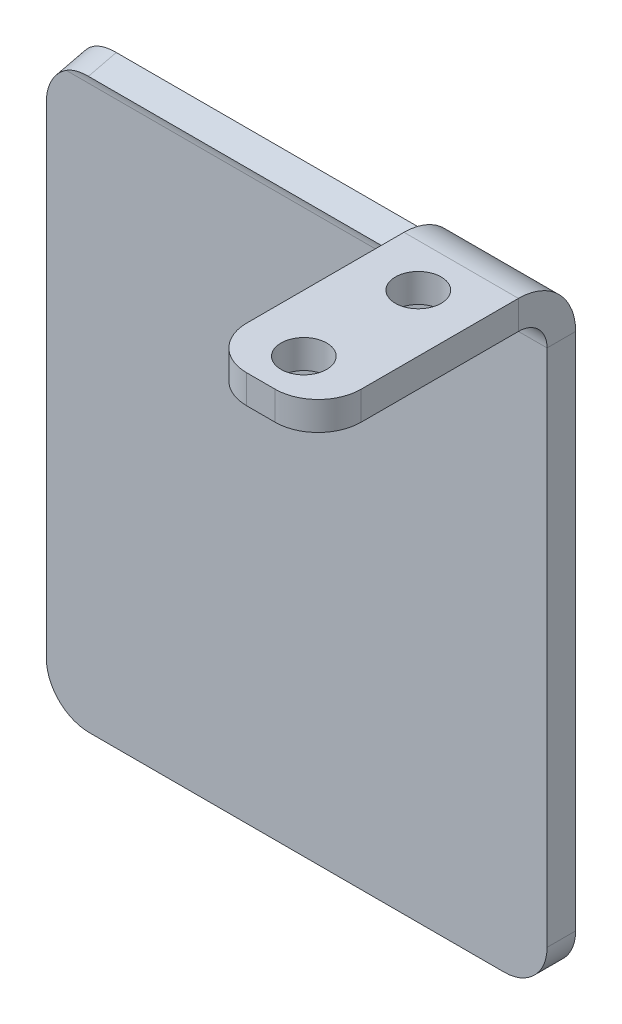
ISO-10303-21;
HEADER;
FILE_DESCRIPTION(('STEP AP214'),'2;1');
FILE_NAME('part.step','',(''),(''),'','','');
FILE_SCHEMA(('AUTOMOTIVE_DESIGN { 1 0 10303 214 1 1 1 1 }'));
ENDSEC;
DATA;
#1=APPLICATION_CONTEXT('core data for automotive mechanical design processes');
#2=APPLICATION_PROTOCOL_DEFINITION('international standard','automotive_design',2000,#1);
#3=PRODUCT_CONTEXT('',#1,'mechanical');
#4=PRODUCT('Part','Part','',(#3));
#5=PRODUCT_RELATED_PRODUCT_CATEGORY('part','',(#4));
#6=PRODUCT_DEFINITION_FORMATION('','',#4);
#7=PRODUCT_DEFINITION_CONTEXT('part definition',#1,'design');
#8=PRODUCT_DEFINITION('design','',#6,#7);
#9=PRODUCT_DEFINITION_SHAPE('','',#8);
#10=(LENGTH_UNIT() NAMED_UNIT(*) SI_UNIT(.MILLI.,.METRE.));
#11=(NAMED_UNIT(*) PLANE_ANGLE_UNIT() SI_UNIT($,.RADIAN.));
#12=(NAMED_UNIT(*) SI_UNIT($,.STERADIAN.) SOLID_ANGLE_UNIT());
#13=UNCERTAINTY_MEASURE_WITH_UNIT(LENGTH_MEASURE(1.E-05),#10,'distance_accuracy_value','');
#14=(GEOMETRIC_REPRESENTATION_CONTEXT(3) GLOBAL_UNCERTAINTY_ASSIGNED_CONTEXT((#13)) GLOBAL_UNIT_ASSIGNED_CONTEXT((#10,
#11,#12)) REPRESENTATION_CONTEXT('',''));
#15=CARTESIAN_POINT('',(0.,0.,0.));
#16=DIRECTION('',(0.,0.,1.));
#17=DIRECTION('',(1.,0.,0.));
#18=AXIS2_PLACEMENT_3D('',#15,#16,#17);
#19=CARTESIAN_POINT('',(-17.5,-3.28761101961529,22.));
#20=DIRECTION('',(-1.,0.,0.));
#21=DIRECTION('',(0.,1.,0.));
#22=AXIS2_PLACEMENT_3D('',#19,#20,#21);
#23=PLANE('',#22);
#24=DIRECTION('',(0.,1.,0.));
#25=VECTOR('',#24,1.);
#26=CARTESIAN_POINT('',(-17.5,-3.28761101961529,22.));
#27=LINE('',#26,#25);
#28=CARTESIAN_POINT('',(-17.5,-40.2876110196153,22.0000000000001));
#29=VERTEX_POINT('',#28);
#30=CARTESIAN_POINT('',(-17.5,-6.60255809537411,22.));
#31=VERTEX_POINT('',#30);
#32=EDGE_CURVE('E173',#29,#31,#27,.T.);
#33=ORIENTED_EDGE('',*,*,#32,.T.);
#34=DIRECTION('',(0.,0.235237573302994,-0.971937901363312));
#35=VECTOR('',#34,1.);
#36=CARTESIAN_POINT('',(-17.5,-6.41911981084092,21.2420827217545));
#37=LINE('',#36,#35);
#38=CARTESIAN_POINT('',(-17.5,-6.11849924146373,20.));
#39=VERTEX_POINT('',#38);
#40=EDGE_CURVE('E379',#31,#39,#37,.T.);
#41=ORIENTED_EDGE('',*,*,#40,.T.);
#42=DIRECTION('',(0.,1.,0.));
#43=VECTOR('',#42,1.);
#44=CARTESIAN_POINT('',(-17.5,-3.2876110196153,20.));
#45=LINE('',#44,#43);
#46=CARTESIAN_POINT('',(-17.5,-40.2876110196153,20.0000000000001));
#47=VERTEX_POINT('',#46);
#48=EDGE_CURVE('E209',#47,#39,#45,.T.);
#49=ORIENTED_EDGE('',*,*,#48,.F.);
#50=DIRECTION('',(0.,0.,-1.));
#51=VECTOR('',#50,1.);
#52=CARTESIAN_POINT('',(-17.5,-40.2876110196153,22.0000000000001));
#53=LINE('',#52,#51);
#54=EDGE_CURVE('E373',#47,#29,#53,.F.);
#55=ORIENTED_EDGE('',*,*,#54,.T.);
#56=EDGE_LOOP('',(#33,#41,#49,#55));
#57=FACE_BOUND('',#56,.T.);
#58=ADVANCED_FACE('F53',(#57),#23,.T.);
#59=CARTESIAN_POINT('',(17.5,-3.28761101961529,22.));
#60=DIRECTION('',(1.,0.,0.));
#61=DIRECTION('',(0.,-1.,0.));
#62=AXIS2_PLACEMENT_3D('',#59,#60,#61);
#63=PLANE('',#62);
#64=DIRECTION('',(0.,-1.,0.));
#65=VECTOR('',#64,1.);
#66=CARTESIAN_POINT('',(17.5,-3.28761101961529,22.));
#67=LINE('',#66,#65);
#68=CARTESIAN_POINT('',(17.5,-4.00000000000001,22.));
#69=VERTEX_POINT('',#68);
#70=CARTESIAN_POINT('',(17.5,-40.2876110196153,22.0000000000001));
#71=VERTEX_POINT('',#70);
#72=EDGE_CURVE('E187',#69,#71,#67,.T.);
#73=ORIENTED_EDGE('',*,*,#72,.T.);
#74=DIRECTION('',(0.,0.,-1.));
#75=VECTOR('',#74,1.);
#76=CARTESIAN_POINT('',(17.5,-40.2876110196153,22.0000000000001));
#77=LINE('',#76,#75);
#78=CARTESIAN_POINT('',(17.5,-40.2876110196153,20.0000000000001));
#79=VERTEX_POINT('',#78);
#80=EDGE_CURVE('E12',#71,#79,#77,.T.);
#81=ORIENTED_EDGE('',*,*,#80,.T.);
#82=DIRECTION('',(0.,-1.,0.));
#83=VECTOR('',#82,1.);
#84=CARTESIAN_POINT('',(17.5,-3.2876110196153,20.));
#85=LINE('',#84,#83);
#86=CARTESIAN_POINT('',(17.5,-4.00000000000002,20.));
#87=VERTEX_POINT('',#86);
#88=EDGE_CURVE('E195',#87,#79,#85,.T.);
#89=ORIENTED_EDGE('',*,*,#88,.F.);
#90=DIRECTION('',(0.,0.,1.));
#91=VECTOR('',#90,1.);
#92=CARTESIAN_POINT('',(17.5,-4.00000000000001,22.));
#93=LINE('',#92,#91);
#94=EDGE_CURVE('E172',#87,#69,#93,.T.);
#95=ORIENTED_EDGE('',*,*,#94,.T.);
#96=EDGE_LOOP('',(#73,#81,#89,#95));
#97=FACE_BOUND('',#96,.T.);
#98=ADVANCED_FACE('F198',(#97),#63,.T.);
#99=CARTESIAN_POINT('',(0.,-23.2876110196153,22.0000000000001));
#100=DIRECTION('',(0.,0.,1.));
#101=DIRECTION('',(0.,-1.,0.));
#102=AXIS2_PLACEMENT_3D('',#99,#100,#101);
#103=PLANE('',#102);
#104=DIRECTION('',(-1.,0.,0.));
#105=VECTOR('',#104,1.);
#106=CARTESIAN_POINT('',(0.,-4.00000000000001,22.));
#107=LINE('',#106,#105);
#108=CARTESIAN_POINT('',(-16.1129178578161,-4.00000000000001,22.));
#109=VERTEX_POINT('',#108);
#110=EDGE_CURVE('E162',#69,#109,#107,.T.);
#111=ORIENTED_EDGE('',*,*,#110,.T.);
#112=CARTESIAN_POINT('',(-14.5,-6.60255809537411,22.));
#113=DIRECTION('',(0.,0.,1.));
#114=DIRECTION('',(0.,1.,0.));
#115=AXIS2_PLACEMENT_3D('',#112,#113,#114);
#116=ELLIPSE('',#115,3.0866169492845,3.);
#117=EDGE_CURVE('E375',#109,#31,#116,.T.);
#118=ORIENTED_EDGE('',*,*,#117,.T.);
#119=ORIENTED_EDGE('',*,*,#32,.F.);
#120=CARTESIAN_POINT('',(-14.5,-40.2876110196153,22.0000000000001));
#121=DIRECTION('',(0.,0.,1.));
#122=DIRECTION('',(0.,-1.,0.));
#123=AXIS2_PLACEMENT_3D('',#120,#121,#122);
#124=CIRCLE('',#123,3.);
#125=CARTESIAN_POINT('',(-14.5,-43.2876110196153,22.0000000000001));
#126=VERTEX_POINT('',#125);
#127=EDGE_CURVE('E372',#29,#126,#124,.T.);
#128=ORIENTED_EDGE('',*,*,#127,.T.);
#129=DIRECTION('',(-1.,0.,0.));
#130=VECTOR('',#129,1.);
#131=CARTESIAN_POINT('',(-17.5,-43.2876110196153,22.0000000000001));
#132=LINE('',#131,#130);
#133=CARTESIAN_POINT('',(14.5,-43.2876110196153,22.0000000000001));
#134=VERTEX_POINT('',#133);
#135=EDGE_CURVE('E194',#134,#126,#132,.T.);
#136=ORIENTED_EDGE('',*,*,#135,.F.);
#137=CARTESIAN_POINT('',(14.5,-40.2876110196153,22.0000000000001));
#138=DIRECTION('',(0.,0.,1.));
#139=DIRECTION('',(0.,-1.,0.));
#140=AXIS2_PLACEMENT_3D('',#137,#138,#139);
#141=CIRCLE('',#140,3.);
#142=EDGE_CURVE('E191',#134,#71,#141,.T.);
#143=ORIENTED_EDGE('',*,*,#142,.T.);
#144=ORIENTED_EDGE('',*,*,#72,.F.);
#145=EDGE_LOOP('',(#111,#118,#119,#128,#136,#143,#144));
#146=FACE_BOUND('',#145,.T.);
#147=ADVANCED_FACE('F188',(#146),#103,.T.);
#148=CARTESIAN_POINT('',(-17.5,-43.2876110196153,22.0000000000001));
#149=DIRECTION('',(0.,-1.,0.));
#150=DIRECTION('',(-1.,0.,0.));
#151=AXIS2_PLACEMENT_3D('',#148,#149,#150);
#152=PLANE('',#151);
#153=ORIENTED_EDGE('',*,*,#135,.T.);
#154=DIRECTION('',(0.,0.,-1.));
#155=VECTOR('',#154,1.);
#156=CARTESIAN_POINT('',(-14.5,-43.2876110196153,22.0000000000001));
#157=LINE('',#156,#155);
#158=CARTESIAN_POINT('',(-14.5,-43.2876110196153,20.0000000000001));
#159=VERTEX_POINT('',#158);
#160=EDGE_CURVE('E61',#126,#159,#157,.T.);
#161=ORIENTED_EDGE('',*,*,#160,.T.);
#162=DIRECTION('',(-1.,0.,0.));
#163=VECTOR('',#162,1.);
#164=CARTESIAN_POINT('',(-17.5,-43.2876110196153,20.0000000000001));
#165=LINE('',#164,#163);
#166=CARTESIAN_POINT('',(14.5,-43.2876110196153,20.0000000000001));
#167=VERTEX_POINT('',#166);
#168=EDGE_CURVE('E212',#167,#159,#165,.T.);
#169=ORIENTED_EDGE('',*,*,#168,.F.);
#170=DIRECTION('',(0.,0.,-1.));
#171=VECTOR('',#170,1.);
#172=CARTESIAN_POINT('',(14.5,-43.2876110196153,22.0000000000001));
#173=LINE('',#172,#171);
#174=EDGE_CURVE('E270',#167,#134,#173,.F.);
#175=ORIENTED_EDGE('',*,*,#174,.T.);
#176=EDGE_LOOP('',(#153,#161,#169,#175));
#177=FACE_BOUND('',#176,.T.);
#178=ADVANCED_FACE('F310',(#177),#152,.T.);
#179=CARTESIAN_POINT('',(0.,-23.2876110196153,20.0000000000001));
#180=DIRECTION('',(0.,0.,1.));
#181=DIRECTION('',(0.,-1.,0.));
#182=AXIS2_PLACEMENT_3D('',#179,#180,#181);
#183=PLANE('',#182);
#184=ORIENTED_EDGE('',*,*,#48,.T.);
#185=CARTESIAN_POINT('',(-14.5,-6.11849924146373,20.));
#186=DIRECTION('',(0.,0.,1.));
#187=DIRECTION('',(0.,1.,0.));
#188=AXIS2_PLACEMENT_3D('',#185,#186,#187);
#189=ELLIPSE('',#188,3.0866169492845,3.);
#190=CARTESIAN_POINT('',(-16.681814452463,-4.00000000000001,20.));
#191=VERTEX_POINT('',#190);
#192=EDGE_CURVE('E271',#39,#191,#189,.F.);
#193=ORIENTED_EDGE('',*,*,#192,.T.);
#194=DIRECTION('',(-1.,0.,0.));
#195=VECTOR('',#194,1.);
#196=CARTESIAN_POINT('',(0.,-4.00000000000001,20.));
#197=LINE('',#196,#195);
#198=EDGE_CURVE('E200',#87,#191,#197,.T.);
#199=ORIENTED_EDGE('',*,*,#198,.F.);
#200=ORIENTED_EDGE('',*,*,#88,.T.);
#201=CARTESIAN_POINT('',(14.5,-40.2876110196153,20.0000000000001));
#202=DIRECTION('',(0.,0.,1.));
#203=DIRECTION('',(0.,-1.,0.));
#204=AXIS2_PLACEMENT_3D('',#201,#202,#203);
#205=CIRCLE('',#204,3.);
#206=EDGE_CURVE('E76',#79,#167,#205,.F.);
#207=ORIENTED_EDGE('',*,*,#206,.T.);
#208=ORIENTED_EDGE('',*,*,#168,.T.);
#209=CARTESIAN_POINT('',(-14.5,-40.2876110196153,20.0000000000001));
#210=DIRECTION('',(0.,0.,1.));
#211=DIRECTION('',(0.,-1.,0.));
#212=AXIS2_PLACEMENT_3D('',#209,#210,#211);
#213=CIRCLE('',#212,3.);
#214=EDGE_CURVE('E68',#159,#47,#213,.F.);
#215=ORIENTED_EDGE('',*,*,#214,.T.);
#216=EDGE_LOOP('',(#184,#193,#199,#200,#207,#208,#215));
#217=FACE_BOUND('',#216,.T.);
#218=ADVANCED_FACE('F294',(#217),#183,.F.);
#219=CARTESIAN_POINT('',(17.5,-2.,38.));
#220=DIRECTION('',(0.,0.,1.));
#221=DIRECTION('',(1.,0.,0.));
#222=AXIS2_PLACEMENT_3D('',#219,#220,#221);
#223=PLANE('',#222);
#224=DIRECTION('',(1.,0.,0.));
#225=VECTOR('',#224,1.);
#226=CARTESIAN_POINT('',(17.5,0.,38.));
#227=LINE('',#226,#225);
#228=CARTESIAN_POINT('',(12.5,0.,38.));
#229=VERTEX_POINT('',#228);
#230=CARTESIAN_POINT('',(14.5,0.,38.));
#231=VERTEX_POINT('',#230);
#232=EDGE_CURVE('E347',#229,#231,#227,.T.);
#233=ORIENTED_EDGE('',*,*,#232,.F.);
#234=DIRECTION('',(0.,1.,0.));
#235=VECTOR('',#234,1.);
#236=CARTESIAN_POINT('',(12.5,-2.,38.));
#237=LINE('',#236,#235);
#238=CARTESIAN_POINT('',(12.5,-2.,38.));
#239=VERTEX_POINT('',#238);
#240=EDGE_CURVE('E231',#229,#239,#237,.F.);
#241=ORIENTED_EDGE('',*,*,#240,.T.);
#242=DIRECTION('',(1.,0.,0.));
#243=VECTOR('',#242,1.);
#244=CARTESIAN_POINT('',(17.5,-2.,38.));
#245=LINE('',#244,#243);
#246=CARTESIAN_POINT('',(14.5,-2.,38.));
#247=VERTEX_POINT('',#246);
#248=EDGE_CURVE('E343',#239,#247,#245,.T.);
#249=ORIENTED_EDGE('',*,*,#248,.T.);
#250=DIRECTION('',(0.,1.,0.));
#251=VECTOR('',#250,1.);
#252=CARTESIAN_POINT('',(14.5,-2.,38.));
#253=LINE('',#252,#251);
#254=EDGE_CURVE('E228',#247,#231,#253,.T.);
#255=ORIENTED_EDGE('',*,*,#254,.T.);
#256=EDGE_LOOP('',(#233,#241,#249,#255));
#257=FACE_BOUND('',#256,.T.);
#258=ADVANCED_FACE('F290',(#257),#223,.T.);
#259=CARTESIAN_POINT('',(0.,-2.,0.));
#260=DIRECTION('',(0.,-1.,0.));
#261=DIRECTION('',(0.,0.,-1.));
#262=AXIS2_PLACEMENT_3D('',#259,#260,#261);
#263=PLANE('',#262);
#264=CARTESIAN_POINT('',(13.5,-2.,35.));
#265=DIRECTION('',(0.,-1.,0.));
#266=DIRECTION('',(0.,0.,-1.));
#267=AXIS2_PLACEMENT_3D('',#264,#265,#266);
#268=CIRCLE('',#267,1.6);
#269=CARTESIAN_POINT('',(13.5,-2.,33.4));
#270=VERTEX_POINT('',#269);
#271=EDGE_CURVE('E218',#270,#270,#268,.T.);
#272=ORIENTED_EDGE('',*,*,#271,.F.);
#273=EDGE_LOOP('',(#272));
#274=FACE_BOUND('',#273,.T.);
#275=CARTESIAN_POINT('',(13.5,-2.,27.));
#276=DIRECTION('',(0.,-1.,0.));
#277=DIRECTION('',(0.,0.,-1.));
#278=AXIS2_PLACEMENT_3D('',#275,#276,#277);
#279=CIRCLE('',#278,1.6);
#280=CARTESIAN_POINT('',(13.5,-2.,25.4));
#281=VERTEX_POINT('',#280);
#282=EDGE_CURVE('E408',#281,#281,#279,.T.);
#283=ORIENTED_EDGE('',*,*,#282,.F.);
#284=EDGE_LOOP('',(#283));
#285=FACE_BOUND('',#284,.T.);
#286=ORIENTED_EDGE('',*,*,#248,.F.);
#287=CARTESIAN_POINT('',(12.5,-2.,35.));
#288=DIRECTION('',(0.,-1.,0.));
#289=DIRECTION('',(0.,0.,-1.));
#290=AXIS2_PLACEMENT_3D('',#287,#288,#289);
#291=CIRCLE('',#290,3.);
#292=CARTESIAN_POINT('',(9.50000000000001,-2.,35.));
#293=VERTEX_POINT('',#292);
#294=EDGE_CURVE('E235',#239,#293,#291,.T.);
#295=ORIENTED_EDGE('',*,*,#294,.T.);
#296=DIRECTION('',(0.,0.,1.));
#297=VECTOR('',#296,1.);
#298=CARTESIAN_POINT('',(9.5,-2.,20.));
#299=LINE('',#298,#297);
#300=CARTESIAN_POINT('',(9.5,-2.,24.));
#301=VERTEX_POINT('',#300);
#302=EDGE_CURVE('E340',#301,#293,#299,.T.);
#303=ORIENTED_EDGE('',*,*,#302,.F.);
#304=DIRECTION('',(-1.,0.,0.));
#305=VECTOR('',#304,1.);
#306=CARTESIAN_POINT('',(0.,-2.,24.));
#307=LINE('',#306,#305);
#308=CARTESIAN_POINT('',(17.5,-2.,24.));
#309=VERTEX_POINT('',#308);
#310=EDGE_CURVE('E367',#309,#301,#307,.T.);
#311=ORIENTED_EDGE('',*,*,#310,.F.);
#312=DIRECTION('',(0.,0.,-1.));
#313=VECTOR('',#312,1.);
#314=CARTESIAN_POINT('',(17.5,-2.,20.));
#315=LINE('',#314,#313);
#316=CARTESIAN_POINT('',(17.5,-2.,35.));
#317=VERTEX_POINT('',#316);
#318=EDGE_CURVE('E362',#317,#309,#315,.T.);
#319=ORIENTED_EDGE('',*,*,#318,.F.);
#320=CARTESIAN_POINT('',(14.5,-2.,35.));
#321=DIRECTION('',(0.,-1.,0.));
#322=DIRECTION('',(0.,0.,-1.));
#323=AXIS2_PLACEMENT_3D('',#320,#321,#322);
#324=CIRCLE('',#323,3.);
#325=EDGE_CURVE('E233',#317,#247,#324,.T.);
#326=ORIENTED_EDGE('',*,*,#325,.T.);
#327=EDGE_LOOP('',(#286,#295,#303,#311,#319,#326));
#328=FACE_BOUND('',#327,.T.);
#329=ADVANCED_FACE('F293',(#274,#285,#328),#263,.T.);
#330=CARTESIAN_POINT('',(17.5,-2.,20.));
#331=DIRECTION('',(1.,0.,0.));
#332=DIRECTION('',(0.,0.,-1.));
#333=AXIS2_PLACEMENT_3D('',#330,#331,#332);
#334=PLANE('',#333);
#335=DIRECTION('',(0.,0.,-1.));
#336=VECTOR('',#335,1.);
#337=CARTESIAN_POINT('',(17.5,0.,20.));
#338=LINE('',#337,#336);
#339=CARTESIAN_POINT('',(17.5,0.,35.));
#340=VERTEX_POINT('',#339);
#341=CARTESIAN_POINT('',(17.5,0.,24.));
#342=VERTEX_POINT('',#341);
#343=EDGE_CURVE('E360',#340,#342,#338,.T.);
#344=ORIENTED_EDGE('',*,*,#343,.F.);
#345=DIRECTION('',(0.,1.,0.));
#346=VECTOR('',#345,1.);
#347=CARTESIAN_POINT('',(17.5,-2.,35.));
#348=LINE('',#347,#346);
#349=EDGE_CURVE('E237',#340,#317,#348,.F.);
#350=ORIENTED_EDGE('',*,*,#349,.T.);
#351=ORIENTED_EDGE('',*,*,#318,.T.);
#352=DIRECTION('',(0.,-1.,0.));
#353=VECTOR('',#352,1.);
#354=CARTESIAN_POINT('',(17.5,-2.,24.));
#355=LINE('',#354,#353);
#356=EDGE_CURVE('E182',#342,#309,#355,.T.);
#357=ORIENTED_EDGE('',*,*,#356,.F.);
#358=EDGE_LOOP('',(#344,#350,#351,#357));
#359=FACE_BOUND('',#358,.T.);
#360=ADVANCED_FACE('F298',(#359),#334,.T.);
#361=CARTESIAN_POINT('',(0.,0.,0.));
#362=DIRECTION('',(0.,-1.,0.));
#363=DIRECTION('',(0.,0.,-1.));
#364=AXIS2_PLACEMENT_3D('',#361,#362,#363);
#365=PLANE('',#364);
#366=CARTESIAN_POINT('',(13.5,0.,35.));
#367=DIRECTION('',(0.,-1.,0.));
#368=DIRECTION('',(0.,0.,-1.));
#369=AXIS2_PLACEMENT_3D('',#366,#367,#368);
#370=CIRCLE('',#369,1.6);
#371=CARTESIAN_POINT('',(13.5,0.,33.4));
#372=VERTEX_POINT('',#371);
#373=EDGE_CURVE('E217',#372,#372,#370,.T.);
#374=ORIENTED_EDGE('',*,*,#373,.T.);
#375=EDGE_LOOP('',(#374));
#376=FACE_BOUND('',#375,.T.);
#377=CARTESIAN_POINT('',(13.5,0.,27.));
#378=DIRECTION('',(0.,-1.,0.));
#379=DIRECTION('',(0.,0.,-1.));
#380=AXIS2_PLACEMENT_3D('',#377,#378,#379);
#381=CIRCLE('',#380,1.6);
#382=CARTESIAN_POINT('',(13.5,0.,25.4));
#383=VERTEX_POINT('',#382);
#384=EDGE_CURVE('E214',#383,#383,#381,.T.);
#385=ORIENTED_EDGE('',*,*,#384,.T.);
#386=EDGE_LOOP('',(#385));
#387=FACE_BOUND('',#386,.T.);
#388=DIRECTION('',(0.,0.,1.));
#389=VECTOR('',#388,1.);
#390=CARTESIAN_POINT('',(9.5,0.,20.));
#391=LINE('',#390,#389);
#392=CARTESIAN_POINT('',(9.5,0.,24.));
#393=VERTEX_POINT('',#392);
#394=CARTESIAN_POINT('',(9.50000000000001,0.,35.));
#395=VERTEX_POINT('',#394);
#396=EDGE_CURVE('E350',#393,#395,#391,.T.);
#397=ORIENTED_EDGE('',*,*,#396,.T.);
#398=CARTESIAN_POINT('',(12.5,0.,35.));
#399=DIRECTION('',(0.,-1.,0.));
#400=DIRECTION('',(0.,0.,-1.));
#401=AXIS2_PLACEMENT_3D('',#398,#399,#400);
#402=CIRCLE('',#401,3.);
#403=EDGE_CURVE('E226',#395,#229,#402,.F.);
#404=ORIENTED_EDGE('',*,*,#403,.T.);
#405=ORIENTED_EDGE('',*,*,#232,.T.);
#406=CARTESIAN_POINT('',(14.5,0.,35.));
#407=DIRECTION('',(0.,-1.,0.));
#408=DIRECTION('',(0.,0.,-1.));
#409=AXIS2_PLACEMENT_3D('',#406,#407,#408);
#410=CIRCLE('',#409,3.);
#411=EDGE_CURVE('E224',#231,#340,#410,.F.);
#412=ORIENTED_EDGE('',*,*,#411,.T.);
#413=ORIENTED_EDGE('',*,*,#343,.T.);
#414=DIRECTION('',(-1.,0.,0.));
#415=VECTOR('',#414,1.);
#416=CARTESIAN_POINT('',(0.,0.,24.));
#417=LINE('',#416,#415);
#418=EDGE_CURVE('E357',#342,#393,#417,.T.);
#419=ORIENTED_EDGE('',*,*,#418,.T.);
#420=EDGE_LOOP('',(#397,#404,#405,#412,#413,#419));
#421=FACE_BOUND('',#420,.T.);
#422=ADVANCED_FACE('F302',(#376,#387,#421),#365,.F.);
#423=CARTESIAN_POINT('',(9.5,-2.,20.));
#424=DIRECTION('',(-1.,0.,0.));
#425=DIRECTION('',(0.,0.,1.));
#426=AXIS2_PLACEMENT_3D('',#423,#424,#425);
#427=PLANE('',#426);
#428=ORIENTED_EDGE('',*,*,#302,.T.);
#429=DIRECTION('',(0.,1.,0.));
#430=VECTOR('',#429,1.);
#431=CARTESIAN_POINT('',(9.50000000000001,-2.,35.));
#432=LINE('',#431,#430);
#433=EDGE_CURVE('E203',#293,#395,#432,.T.);
#434=ORIENTED_EDGE('',*,*,#433,.T.);
#435=ORIENTED_EDGE('',*,*,#396,.F.);
#436=DIRECTION('',(0.,1.,0.));
#437=VECTOR('',#436,1.);
#438=CARTESIAN_POINT('',(9.5,-2.,24.));
#439=LINE('',#438,#437);
#440=EDGE_CURVE('E346',#301,#393,#439,.T.);
#441=ORIENTED_EDGE('',*,*,#440,.F.);
#442=EDGE_LOOP('',(#428,#434,#435,#441));
#443=FACE_BOUND('',#442,.T.);
#444=ADVANCED_FACE('F289',(#443),#427,.T.);
#445=CARTESIAN_POINT('',(17.5,-4.,24.));
#446=DIRECTION('',(-1.,0.,0.));
#447=DIRECTION('',(0.,0.,1.));
#448=AXIS2_PLACEMENT_3D('',#445,#446,#447);
#449=PLANE('',#448);
#450=ORIENTED_EDGE('',*,*,#94,.F.);
#451=CARTESIAN_POINT('',(17.5,-4.,24.));
#452=DIRECTION('',(1.,0.,0.));
#453=DIRECTION('',(0.,0.,-1.));
#454=AXIS2_PLACEMENT_3D('',#451,#452,#453);
#455=CIRCLE('',#454,4.);
#456=EDGE_CURVE('E221',#87,#342,#455,.T.);
#457=ORIENTED_EDGE('',*,*,#456,.T.);
#458=ORIENTED_EDGE('',*,*,#356,.T.);
#459=CARTESIAN_POINT('',(17.5,-4.,24.));
#460=DIRECTION('',(1.,0.,0.));
#461=DIRECTION('',(0.,0.,1.));
#462=AXIS2_PLACEMENT_3D('',#459,#460,#461);
#463=CIRCLE('',#462,2.);
#464=EDGE_CURVE('E167',#69,#309,#463,.T.);
#465=ORIENTED_EDGE('',*,*,#464,.F.);
#466=EDGE_LOOP('',(#450,#457,#458,#465));
#467=FACE_BOUND('',#466,.T.);
#468=ADVANCED_FACE('F177',(#467),#449,.F.);
#469=CARTESIAN_POINT('',(9.50000000000001,-4.,24.));
#470=DIRECTION('',(1.,0.,0.));
#471=DIRECTION('',(0.,0.,-1.));
#472=AXIS2_PLACEMENT_3D('',#469,#470,#471);
#473=PLANE('',#472);
#474=ORIENTED_EDGE('',*,*,#440,.T.);
#475=CARTESIAN_POINT('',(9.50000000000001,-4.,24.));
#476=DIRECTION('',(1.,0.,0.));
#477=DIRECTION('',(0.,0.,-1.));
#478=AXIS2_PLACEMENT_3D('',#475,#476,#477);
#479=CIRCLE('',#478,4.);
#480=CARTESIAN_POINT('',(9.50000000000001,-3.05904970678802,20.1122483945467));
#481=VERTEX_POINT('',#480);
#482=EDGE_CURVE('E397',#393,#481,#479,.F.);
#483=ORIENTED_EDGE('',*,*,#482,.T.);
#484=DIRECTION('',(0.,-0.235237573302994,0.971937901363312));
#485=VECTOR('',#484,1.);
#486=CARTESIAN_POINT('',(9.50000000000001,-3.52952485339401,22.0561241972734));
#487=LINE('',#486,#485);
#488=CARTESIAN_POINT('',(9.50000000000001,-3.52952485339401,22.0561241972734));
#489=VERTEX_POINT('',#488);
#490=EDGE_CURVE('E353',#481,#489,#487,.T.);
#491=ORIENTED_EDGE('',*,*,#490,.T.);
#492=CARTESIAN_POINT('',(9.50000000000001,-4.,24.));
#493=DIRECTION('',(-1.,0.,0.));
#494=DIRECTION('',(0.,0.,-1.));
#495=AXIS2_PLACEMENT_3D('',#492,#493,#494);
#496=CIRCLE('',#495,2.);
#497=EDGE_CURVE('E183',#301,#489,#496,.T.);
#498=ORIENTED_EDGE('',*,*,#497,.F.);
#499=EDGE_LOOP('',(#474,#483,#491,#498));
#500=FACE_BOUND('',#499,.T.);
#501=ADVANCED_FACE('F282',(#500),#473,.F.);
#502=CARTESIAN_POINT('',(-4.,-3.52952485339401,22.0561241972734));
#503=DIRECTION('',(0.,-0.971937901363312,-0.235237573302994));
#504=DIRECTION('',(-1.,0.,0.));
#505=AXIS2_PLACEMENT_3D('',#502,#503,#504);
#506=PLANE('',#505);
#507=DIRECTION('',(1.,0.,0.));
#508=VECTOR('',#507,1.);
#509=CARTESIAN_POINT('',(-21.8723989842709,-3.05904970678802,20.1122483945467));
#510=LINE('',#509,#508);
#511=CARTESIAN_POINT('',(-14.5,-3.05904970678802,20.1122483945467));
#512=VERTEX_POINT('',#511);
#513=EDGE_CURVE('E184',#481,#512,#510,.F.);
#514=ORIENTED_EDGE('',*,*,#513,.T.);
#515=DIRECTION('',(0.,-0.235237573302994,0.971937901363312));
#516=VECTOR('',#515,1.);
#517=CARTESIAN_POINT('',(-14.5,-3.52952485339401,22.0561241972734));
#518=LINE('',#517,#516);
#519=CARTESIAN_POINT('',(-14.5,-3.52952485339401,22.0561241972734));
#520=VERTEX_POINT('',#519);
#521=EDGE_CURVE('E239',#512,#520,#518,.T.);
#522=ORIENTED_EDGE('',*,*,#521,.T.);
#523=DIRECTION('',(-1.,0.,0.));
#524=VECTOR('',#523,1.);
#525=CARTESIAN_POINT('',(-17.5,-3.52952485339401,22.0561241972734));
#526=LINE('',#525,#524);
#527=EDGE_CURVE('E390',#489,#520,#526,.T.);
#528=ORIENTED_EDGE('',*,*,#527,.F.);
#529=ORIENTED_EDGE('',*,*,#490,.F.);
#530=EDGE_LOOP('',(#514,#522,#528,#529));
#531=FACE_BOUND('',#530,.T.);
#532=ADVANCED_FACE('F279',(#531),#506,.F.);
#533=CARTESIAN_POINT('',(-21.8723989842709,-4.,24.));
#534=DIRECTION('',(1.,0.,0.));
#535=DIRECTION('',(0.,0.,-1.));
#536=AXIS2_PLACEMENT_3D('',#533,#534,#535);
#537=CYLINDRICAL_SURFACE('',#536,2.);
#538=ORIENTED_EDGE('',*,*,#527,.T.);
#539=CARTESIAN_POINT('',(-14.5,-3.52952485339401,22.0561241972734));
#540=CARTESIAN_POINT('',(-14.5860157214,-3.52952596424635,22.0561686173717));
#541=CARTESIAN_POINT('',(-14.6720296069713,-3.53312050123387,22.0552553469484));
#542=CARTESIAN_POINT('',(-14.8434466183334,-3.54750513615987,22.0518343268314));
#543=CARTESIAN_POINT('',(-14.9288495619897,-3.55829729633083,22.0493261201729));
#544=CARTESIAN_POINT('',(-15.0962955929334,-3.586730663957,22.043114081921));
#545=CARTESIAN_POINT('',(-15.1783695836081,-3.60419627435314,22.0394412841469));
#546=CARTESIAN_POINT('',(-15.340684943747,-3.64597037859239,22.0314684963611));
#547=CARTESIAN_POINT('',(-15.4209269041648,-3.6702766311622,22.0271687119977));
#548=CARTESIAN_POINT('',(-15.6067309821121,-3.73546127033332,22.0172082507187));
#549=CARTESIAN_POINT('',(-15.7113324147901,-3.77916248566622,22.0115976161584));
#550=CARTESIAN_POINT('',(-15.8645961818991,-3.85434888867137,22.0051497933592));
#551=CARTESIAN_POINT('',(-15.9154914085223,-3.88128625597679,22.003321709268));
#552=CARTESIAN_POINT('',(-16.0155564154901,-3.93830168315202,22.0007489263237));
#553=CARTESIAN_POINT('',(-16.0647251834185,-3.9683815460402,22.0000048531252));
#554=CARTESIAN_POINT('',(-16.1129178578161,-4.00000000000001,22.));
#555=B_SPLINE_CURVE_WITH_KNOTS('',3,(#539,#540,#541,#542,#543,#544,#545,#546,#547,#548,#549,
#550,#551,#552,#553,#554),.UNSPECIFIED.,.F.,.F.,(4,2,2,2,2,2,2,4),(0.,0.257964365005879,
0.516002672638936,0.767672977911099,1.0192609215336,1.35884833779424,1.531583815736,
1.70441895132757),.UNSPECIFIED.);
#556=EDGE_CURVE('E168',#520,#109,#555,.T.);
#557=ORIENTED_EDGE('',*,*,#556,.T.);
#558=ORIENTED_EDGE('',*,*,#110,.F.);
#559=ORIENTED_EDGE('',*,*,#464,.T.);
#560=ORIENTED_EDGE('',*,*,#310,.T.);
#561=ORIENTED_EDGE('',*,*,#497,.T.);
#562=EDGE_LOOP('',(#538,#557,#558,#559,#560,#561));
#563=FACE_BOUND('',#562,.T.);
#564=ADVANCED_FACE('F165',(#563),#537,.F.);
#565=CARTESIAN_POINT('',(-21.8723989842709,-4.,24.));
#566=DIRECTION('',(1.,0.,0.));
#567=DIRECTION('',(0.,0.,-1.));
#568=AXIS2_PLACEMENT_3D('',#565,#566,#567);
#569=CYLINDRICAL_SURFACE('',#568,4.);
#570=ORIENTED_EDGE('',*,*,#198,.T.);
#571=CARTESIAN_POINT('',(-16.681814452463,-4.00000000000001,20.));
#572=CARTESIAN_POINT('',(-16.627094890353,-3.94031777042125,19.9999997818215));
#573=CARTESIAN_POINT('',(-16.5698296669748,-3.88300131669577,20.0013356819852));
#574=CARTESIAN_POINT('',(-16.450706888507,-3.77351229502566,20.0060416493355));
#575=CARTESIAN_POINT('',(-16.3888518277166,-3.7213369685622,20.0094106186702));
#576=CARTESIAN_POINT('',(-16.2611142900643,-3.62257471361166,20.0175380133581));
#577=CARTESIAN_POINT('',(-16.1952399893832,-3.5759769757988,20.0222936877128));
#578=CARTESIAN_POINT('',(-16.0598647115043,-3.48851434815381,20.0325931273702));
#579=CARTESIAN_POINT('',(-15.9903634046752,-3.4476499806338,20.0381369643824));
#580=CARTESIAN_POINT('',(-15.777353838931,-3.33407817734273,20.0550741682581));
#581=CARTESIAN_POINT('',(-15.6290626947245,-3.27017902357581,20.0667955724029));
#582=CARTESIAN_POINT('',(-15.3240717618195,-3.16711469386894,20.0873170309547));
#583=CARTESIAN_POINT('',(-15.1673774773161,-3.1279335368466,20.0961189711515));
#584=CARTESIAN_POINT('',(-14.9245662209222,-3.08722418875547,20.1055131418658));
#585=CARTESIAN_POINT('',(-14.839949469901,-3.07665362466039,20.1080195341398));
#586=CARTESIAN_POINT('',(-14.670232481314,-3.0625727613714,20.1113942639159));
#587=CARTESIAN_POINT('',(-14.5851332160124,-3.0590513603276,20.1122651770284));
#588=CARTESIAN_POINT('',(-14.5,-3.05904970678802,20.1122483945467));
#589=B_SPLINE_CURVE_WITH_KNOTS('',3,(#571,#572,#573,#574,#575,#576,#577,#578,#579,#580,#581,
#582,#583,#584,#585,#586,#587,#588),.UNSPECIFIED.,.F.,.F.,(4,2,2,2,2,2,2,2,4),(0.,
0.242792121144561,0.485453252356597,0.727636220820102,0.969841237934282,1.45321338698082,
1.93627269723431,2.19193079685156,2.44718593828856),.UNSPECIFIED.);
#590=EDGE_CURVE('E263',#191,#512,#589,.T.);
#591=ORIENTED_EDGE('',*,*,#590,.T.);
#592=ORIENTED_EDGE('',*,*,#513,.F.);
#593=ORIENTED_EDGE('',*,*,#482,.F.);
#594=ORIENTED_EDGE('',*,*,#418,.F.);
#595=ORIENTED_EDGE('',*,*,#456,.F.);
#596=EDGE_LOOP('',(#570,#591,#592,#593,#594,#595));
#597=FACE_BOUND('',#596,.T.);
#598=ADVANCED_FACE('F273',(#597),#569,.T.);
#599=CARTESIAN_POINT('',(13.5,8.,27.));
#600=DIRECTION('',(0.,-1.,0.));
#601=DIRECTION('',(0.,0.,-1.));
#602=AXIS2_PLACEMENT_3D('',#599,#600,#601);
#603=CYLINDRICAL_SURFACE('',#602,1.6);
#604=ORIENTED_EDGE('',*,*,#282,.T.);
#605=EDGE_LOOP('',(#604));
#606=FACE_BOUND('',#605,.T.);
#607=ORIENTED_EDGE('',*,*,#384,.F.);
#608=EDGE_LOOP('',(#607));
#609=FACE_BOUND('',#608,.T.);
#610=ADVANCED_FACE('F277',(#606,#609),#603,.F.);
#611=CARTESIAN_POINT('',(13.5,8.,35.));
#612=DIRECTION('',(0.,-1.,0.));
#613=DIRECTION('',(0.,0.,-1.));
#614=AXIS2_PLACEMENT_3D('',#611,#612,#613);
#615=CYLINDRICAL_SURFACE('',#614,1.6);
#616=ORIENTED_EDGE('',*,*,#271,.T.);
#617=EDGE_LOOP('',(#616));
#618=FACE_BOUND('',#617,.T.);
#619=ORIENTED_EDGE('',*,*,#373,.F.);
#620=EDGE_LOOP('',(#619));
#621=FACE_BOUND('',#620,.T.);
#622=ADVANCED_FACE('F324',(#618,#621),#615,.F.);
#623=CARTESIAN_POINT('',(12.5,-2.,35.));
#624=DIRECTION('',(0.,1.,0.));
#625=DIRECTION('',(0.,0.,1.));
#626=AXIS2_PLACEMENT_3D('',#623,#624,#625);
#627=CYLINDRICAL_SURFACE('',#626,3.);
#628=ORIENTED_EDGE('',*,*,#294,.F.);
#629=ORIENTED_EDGE('',*,*,#240,.F.);
#630=ORIENTED_EDGE('',*,*,#403,.F.);
#631=ORIENTED_EDGE('',*,*,#433,.F.);
#632=EDGE_LOOP('',(#628,#629,#630,#631));
#633=FACE_BOUND('',#632,.T.);
#634=ADVANCED_FACE('F322',(#633),#627,.T.);
#635=CARTESIAN_POINT('',(14.5,-2.,35.));
#636=DIRECTION('',(0.,1.,0.));
#637=DIRECTION('',(0.,0.,1.));
#638=AXIS2_PLACEMENT_3D('',#635,#636,#637);
#639=CYLINDRICAL_SURFACE('',#638,3.);
#640=ORIENTED_EDGE('',*,*,#325,.F.);
#641=ORIENTED_EDGE('',*,*,#349,.F.);
#642=ORIENTED_EDGE('',*,*,#411,.F.);
#643=ORIENTED_EDGE('',*,*,#254,.F.);
#644=EDGE_LOOP('',(#640,#641,#642,#643));
#645=FACE_BOUND('',#644,.T.);
#646=ADVANCED_FACE('F258',(#645),#639,.T.);
#647=CARTESIAN_POINT('',(-14.5,-6.44533855748395,21.3504114773644));
#648=DIRECTION('',(0.,0.235237573302994,-0.971937901363312));
#649=DIRECTION('',(0.,0.971937901363312,0.235237573302994));
#650=AXIS2_PLACEMENT_3D('',#647,#648,#649);
#651=CYLINDRICAL_SURFACE('',#650,3.);
#652=ORIENTED_EDGE('',*,*,#192,.F.);
#653=ORIENTED_EDGE('',*,*,#40,.F.);
#654=ORIENTED_EDGE('',*,*,#117,.F.);
#655=ORIENTED_EDGE('',*,*,#556,.F.);
#656=ORIENTED_EDGE('',*,*,#521,.F.);
#657=ORIENTED_EDGE('',*,*,#590,.F.);
#658=EDGE_LOOP('',(#652,#653,#654,#655,#656,#657));
#659=FACE_BOUND('',#658,.T.);
#660=ADVANCED_FACE('F253',(#659),#651,.T.);
#661=CARTESIAN_POINT('',(-14.5,-40.2876110196153,22.0000000000001));
#662=DIRECTION('',(0.,0.,-1.));
#663=DIRECTION('',(0.,1.,0.));
#664=AXIS2_PLACEMENT_3D('',#661,#662,#663);
#665=CYLINDRICAL_SURFACE('',#664,3.);
#666=ORIENTED_EDGE('',*,*,#127,.F.);
#667=ORIENTED_EDGE('',*,*,#54,.F.);
#668=ORIENTED_EDGE('',*,*,#214,.F.);
#669=ORIENTED_EDGE('',*,*,#160,.F.);
#670=EDGE_LOOP('',(#666,#667,#668,#669));
#671=FACE_BOUND('',#670,.T.);
#672=ADVANCED_FACE('F257',(#671),#665,.T.);
#673=CARTESIAN_POINT('',(14.5,-40.2876110196153,22.0000000000001));
#674=DIRECTION('',(0.,0.,-1.));
#675=DIRECTION('',(0.,1.,0.));
#676=AXIS2_PLACEMENT_3D('',#673,#674,#675);
#677=CYLINDRICAL_SURFACE('',#676,3.);
#678=ORIENTED_EDGE('',*,*,#142,.F.);
#679=ORIENTED_EDGE('',*,*,#174,.F.);
#680=ORIENTED_EDGE('',*,*,#206,.F.);
#681=ORIENTED_EDGE('',*,*,#80,.F.);
#682=EDGE_LOOP('',(#678,#679,#680,#681));
#683=FACE_BOUND('',#682,.T.);
#684=ADVANCED_FACE('F55',(#683),#677,.T.);
#685=CLOSED_SHELL('',(#58,#98,#147,#178,#218,#258,#329,#360,#422,#444,#468,#501,#532,#564,#598,
#610,#622,#634,#646,#660,#672,#684));
#686=MANIFOLD_SOLID_BREP('B2',#685);
#687=ADVANCED_BREP_SHAPE_REPRESENTATION('',(#18,#686),#14);
#688=SHAPE_DEFINITION_REPRESENTATION(#9,#687);
ENDSEC;
END-ISO-10303-21;
